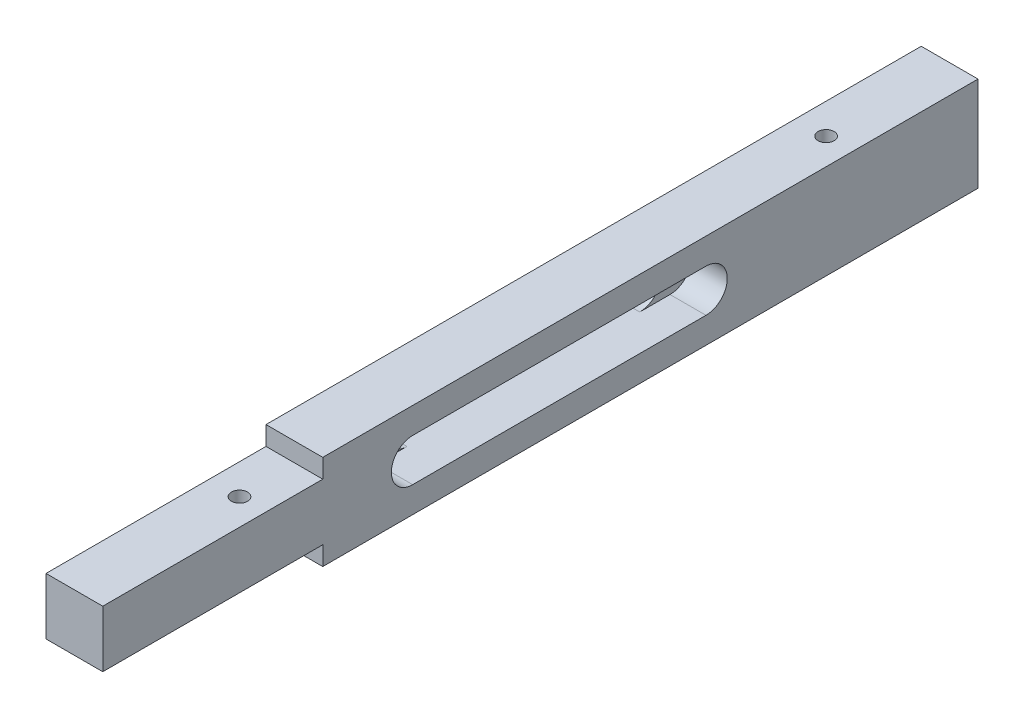
ISO-10303-21;
HEADER;
FILE_DESCRIPTION(('STEP AP214'),'2;1');
FILE_NAME('part.step','',(''),(''),'','','');
FILE_SCHEMA(('AUTOMOTIVE_DESIGN { 1 0 10303 214 1 1 1 1 }'));
ENDSEC;
DATA;
#1=APPLICATION_CONTEXT('core data for automotive mechanical design processes');
#2=APPLICATION_PROTOCOL_DEFINITION('international standard','automotive_design',2000,#1);
#3=PRODUCT_CONTEXT('',#1,'mechanical');
#4=PRODUCT('Part','Part','',(#3));
#5=PRODUCT_RELATED_PRODUCT_CATEGORY('part','',(#4));
#6=PRODUCT_DEFINITION_FORMATION('','',#4);
#7=PRODUCT_DEFINITION_CONTEXT('part definition',#1,'design');
#8=PRODUCT_DEFINITION('design','',#6,#7);
#9=PRODUCT_DEFINITION_SHAPE('','',#8);
#10=(LENGTH_UNIT() NAMED_UNIT(*) SI_UNIT(.MILLI.,.METRE.));
#11=(NAMED_UNIT(*) PLANE_ANGLE_UNIT() SI_UNIT($,.RADIAN.));
#12=(NAMED_UNIT(*) SI_UNIT($,.STERADIAN.) SOLID_ANGLE_UNIT());
#13=UNCERTAINTY_MEASURE_WITH_UNIT(LENGTH_MEASURE(1.E-05),#10,'distance_accuracy_value','');
#14=(GEOMETRIC_REPRESENTATION_CONTEXT(3) GLOBAL_UNCERTAINTY_ASSIGNED_CONTEXT((#13)) GLOBAL_UNIT_ASSIGNED_CONTEXT((#10,
#11,#12)) REPRESENTATION_CONTEXT('',''));
#15=CARTESIAN_POINT('',(0.,0.,0.));
#16=DIRECTION('',(0.,0.,1.));
#17=DIRECTION('',(1.,0.,0.));
#18=AXIS2_PLACEMENT_3D('',#15,#16,#17);
#19=CARTESIAN_POINT('',(-6.,0.,0.));
#20=DIRECTION('',(-1.,0.,0.));
#21=DIRECTION('',(0.,0.,1.));
#22=AXIS2_PLACEMENT_3D('',#19,#20,#21);
#23=PLANE('',#22);
#24=DIRECTION('',(0.,0.,-1.));
#25=VECTOR('',#24,1.);
#26=CARTESIAN_POINT('',(-6.,5.,25.));
#27=LINE('',#26,#25);
#28=CARTESIAN_POINT('',(-6.,5.,25.));
#29=VERTEX_POINT('',#28);
#30=CARTESIAN_POINT('',(-6.,5.,-44.25));
#31=VERTEX_POINT('',#30);
#32=EDGE_CURVE('E149',#29,#31,#27,.T.);
#33=ORIENTED_EDGE('',*,*,#32,.T.);
#34=DIRECTION('',(0.,-1.,0.));
#35=VECTOR('',#34,1.);
#36=CARTESIAN_POINT('',(-6.,0.,-44.25));
#37=LINE('',#36,#35);
#38=CARTESIAN_POINT('',(-6.,-5.,-44.25));
#39=VERTEX_POINT('',#38);
#40=EDGE_CURVE('E153',#31,#39,#37,.T.);
#41=ORIENTED_EDGE('',*,*,#40,.T.);
#42=DIRECTION('',(0.,0.,-1.));
#43=VECTOR('',#42,1.);
#44=CARTESIAN_POINT('',(-6.,-5.,25.));
#45=LINE('',#44,#43);
#46=CARTESIAN_POINT('',(-6.,-5.,25.));
#47=VERTEX_POINT('',#46);
#48=EDGE_CURVE('E159',#47,#39,#45,.T.);
#49=ORIENTED_EDGE('',*,*,#48,.F.);
#50=DIRECTION('',(0.,-1.,0.));
#51=VECTOR('',#50,1.);
#52=CARTESIAN_POINT('',(-6.,-3.,25.));
#53=LINE('',#52,#51);
#54=CARTESIAN_POINT('',(-6.,-3.,25.));
#55=VERTEX_POINT('',#54);
#56=EDGE_CURVE('E234',#55,#47,#53,.T.);
#57=ORIENTED_EDGE('',*,*,#56,.F.);
#58=DIRECTION('',(0.,0.,-1.));
#59=VECTOR('',#58,1.);
#60=CARTESIAN_POINT('',(-6.,-3.,48.25));
#61=LINE('',#60,#59);
#62=CARTESIAN_POINT('',(-6.,-3.,48.25));
#63=VERTEX_POINT('',#62);
#64=EDGE_CURVE('E237',#63,#55,#61,.T.);
#65=ORIENTED_EDGE('',*,*,#64,.F.);
#66=DIRECTION('',(0.,-1.,0.));
#67=VECTOR('',#66,1.);
#68=CARTESIAN_POINT('',(-6.,3.,48.25));
#69=LINE('',#68,#67);
#70=CARTESIAN_POINT('',(-6.,3.,48.25));
#71=VERTEX_POINT('',#70);
#72=EDGE_CURVE('E240',#71,#63,#69,.T.);
#73=ORIENTED_EDGE('',*,*,#72,.F.);
#74=DIRECTION('',(0.,0.,-1.));
#75=VECTOR('',#74,1.);
#76=CARTESIAN_POINT('',(-6.,3.,48.25));
#77=LINE('',#76,#75);
#78=CARTESIAN_POINT('',(-6.,3.,25.));
#79=VERTEX_POINT('',#78);
#80=EDGE_CURVE('E243',#71,#79,#77,.T.);
#81=ORIENTED_EDGE('',*,*,#80,.T.);
#82=DIRECTION('',(0.,-1.,0.));
#83=VECTOR('',#82,1.);
#84=CARTESIAN_POINT('',(-6.,5.,25.));
#85=LINE('',#84,#83);
#86=EDGE_CURVE('E156',#29,#79,#85,.T.);
#87=ORIENTED_EDGE('',*,*,#86,.F.);
#88=EDGE_LOOP('',(#33,#41,#49,#57,#65,#73,#81,#87));
#89=FACE_BOUND('',#88,.T.);
#90=CARTESIAN_POINT('',(-6.,0.,-12.3));
#91=DIRECTION('',(1.,0.,0.));
#92=DIRECTION('',(0.,0.,-1.));
#93=AXIS2_PLACEMENT_3D('',#90,#91,#92);
#94=CIRCLE('',#93,2.25);
#95=CARTESIAN_POINT('',(-6.,-2.25,-12.3));
#96=VERTEX_POINT('',#95);
#97=CARTESIAN_POINT('',(-6.,2.25,-12.3));
#98=VERTEX_POINT('',#97);
#99=EDGE_CURVE('E183',#96,#98,#94,.T.);
#100=ORIENTED_EDGE('',*,*,#99,.T.);
#101=DIRECTION('',(0.,0.,-1.));
#102=VECTOR('',#101,1.);
#103=CARTESIAN_POINT('',(-6.,2.25,12.3));
#104=LINE('',#103,#102);
#105=CARTESIAN_POINT('',(-6.,2.25,12.3));
#106=VERTEX_POINT('',#105);
#107=EDGE_CURVE('E169',#106,#98,#104,.T.);
#108=ORIENTED_EDGE('',*,*,#107,.F.);
#109=CARTESIAN_POINT('',(-6.,0.,12.3));
#110=DIRECTION('',(1.,0.,0.));
#111=DIRECTION('',(0.,0.,-1.));
#112=AXIS2_PLACEMENT_3D('',#109,#110,#111);
#113=CIRCLE('',#112,2.25);
#114=CARTESIAN_POINT('',(-6.,-2.25,12.3));
#115=VERTEX_POINT('',#114);
#116=EDGE_CURVE('E187',#106,#115,#113,.T.);
#117=ORIENTED_EDGE('',*,*,#116,.T.);
#118=DIRECTION('',(0.,0.,-1.));
#119=VECTOR('',#118,1.);
#120=CARTESIAN_POINT('',(-6.,-2.25,12.3));
#121=LINE('',#120,#119);
#122=EDGE_CURVE('E50',#115,#96,#121,.T.);
#123=ORIENTED_EDGE('',*,*,#122,.T.);
#124=EDGE_LOOP('',(#100,#108,#117,#123));
#125=FACE_BOUND('',#124,.T.);
#126=ADVANCED_FACE('F34',(#89,#125),#23,.T.);
#127=CARTESIAN_POINT('',(0.,0.,0.));
#128=DIRECTION('',(-1.,0.,0.));
#129=DIRECTION('',(0.,0.,1.));
#130=AXIS2_PLACEMENT_3D('',#127,#128,#129);
#131=PLANE('',#130);
#132=DIRECTION('',(0.,-1.,0.));
#133=VECTOR('',#132,1.);
#134=CARTESIAN_POINT('',(0.,0.,-44.25));
#135=LINE('',#134,#133);
#136=CARTESIAN_POINT('',(0.,5.,-44.25));
#137=VERTEX_POINT('',#136);
#138=CARTESIAN_POINT('',(0.,-5.,-44.25));
#139=VERTEX_POINT('',#138);
#140=EDGE_CURVE('E170',#137,#139,#135,.T.);
#141=ORIENTED_EDGE('',*,*,#140,.F.);
#142=DIRECTION('',(0.,0.,-1.));
#143=VECTOR('',#142,1.);
#144=CARTESIAN_POINT('',(0.,5.,25.));
#145=LINE('',#144,#143);
#146=CARTESIAN_POINT('',(0.,5.,25.));
#147=VERTEX_POINT('',#146);
#148=EDGE_CURVE('E173',#147,#137,#145,.T.);
#149=ORIENTED_EDGE('',*,*,#148,.F.);
#150=DIRECTION('',(0.,-1.,0.));
#151=VECTOR('',#150,1.);
#152=CARTESIAN_POINT('',(0.,5.,25.));
#153=LINE('',#152,#151);
#154=CARTESIAN_POINT('',(0.,3.,25.));
#155=VERTEX_POINT('',#154);
#156=EDGE_CURVE('E160',#147,#155,#153,.T.);
#157=ORIENTED_EDGE('',*,*,#156,.T.);
#158=DIRECTION('',(0.,0.,-1.));
#159=VECTOR('',#158,1.);
#160=CARTESIAN_POINT('',(0.,3.,48.25));
#161=LINE('',#160,#159);
#162=CARTESIAN_POINT('',(0.,3.,48.25));
#163=VERTEX_POINT('',#162);
#164=EDGE_CURVE('E259',#163,#155,#161,.T.);
#165=ORIENTED_EDGE('',*,*,#164,.F.);
#166=DIRECTION('',(0.,-1.,0.));
#167=VECTOR('',#166,1.);
#168=CARTESIAN_POINT('',(0.,3.,48.25));
#169=LINE('',#168,#167);
#170=CARTESIAN_POINT('',(0.,-3.,48.25));
#171=VERTEX_POINT('',#170);
#172=EDGE_CURVE('E256',#163,#171,#169,.T.);
#173=ORIENTED_EDGE('',*,*,#172,.T.);
#174=DIRECTION('',(0.,0.,-1.));
#175=VECTOR('',#174,1.);
#176=CARTESIAN_POINT('',(0.,-3.,48.25));
#177=LINE('',#176,#175);
#178=CARTESIAN_POINT('',(0.,-3.,25.));
#179=VERTEX_POINT('',#178);
#180=EDGE_CURVE('E253',#171,#179,#177,.T.);
#181=ORIENTED_EDGE('',*,*,#180,.T.);
#182=DIRECTION('',(0.,-1.,0.));
#183=VECTOR('',#182,1.);
#184=CARTESIAN_POINT('',(0.,-3.,25.));
#185=LINE('',#184,#183);
#186=CARTESIAN_POINT('',(0.,-5.,25.));
#187=VERTEX_POINT('',#186);
#188=EDGE_CURVE('E250',#179,#187,#185,.T.);
#189=ORIENTED_EDGE('',*,*,#188,.T.);
#190=DIRECTION('',(0.,0.,-1.));
#191=VECTOR('',#190,1.);
#192=CARTESIAN_POINT('',(0.,-5.,25.));
#193=LINE('',#192,#191);
#194=EDGE_CURVE('E248',#187,#139,#193,.T.);
#195=ORIENTED_EDGE('',*,*,#194,.T.);
#196=EDGE_LOOP('',(#141,#149,#157,#165,#173,#181,#189,#195));
#197=FACE_BOUND('',#196,.T.);
#198=DIRECTION('',(0.,0.,-1.));
#199=VECTOR('',#198,1.);
#200=CARTESIAN_POINT('',(0.,2.25,15.5));
#201=LINE('',#200,#199);
#202=CARTESIAN_POINT('',(0.,2.25,15.5));
#203=VERTEX_POINT('',#202);
#204=CARTESIAN_POINT('',(0.,2.25,-15.5));
#205=VERTEX_POINT('',#204);
#206=EDGE_CURVE('E198',#203,#205,#201,.T.);
#207=ORIENTED_EDGE('',*,*,#206,.T.);
#208=CARTESIAN_POINT('',(0.,0.,-15.5));
#209=DIRECTION('',(1.,0.,0.));
#210=DIRECTION('',(0.,0.,-1.));
#211=AXIS2_PLACEMENT_3D('',#208,#209,#210);
#212=CIRCLE('',#211,2.25);
#213=CARTESIAN_POINT('',(0.,-2.24999999999999,-15.5));
#214=VERTEX_POINT('',#213);
#215=EDGE_CURVE('E215',#214,#205,#212,.T.);
#216=ORIENTED_EDGE('',*,*,#215,.F.);
#217=DIRECTION('',(0.,0.,-1.));
#218=VECTOR('',#217,1.);
#219=CARTESIAN_POINT('',(0.,-2.25,15.5));
#220=LINE('',#219,#218);
#221=CARTESIAN_POINT('',(0.,-2.25,15.5));
#222=VERTEX_POINT('',#221);
#223=EDGE_CURVE('E218',#222,#214,#220,.T.);
#224=ORIENTED_EDGE('',*,*,#223,.F.);
#225=CARTESIAN_POINT('',(0.,0.,15.5));
#226=DIRECTION('',(1.,0.,0.));
#227=DIRECTION('',(0.,0.,-1.));
#228=AXIS2_PLACEMENT_3D('',#225,#226,#227);
#229=CIRCLE('',#228,2.25);
#230=EDGE_CURVE('E220',#203,#222,#229,.T.);
#231=ORIENTED_EDGE('',*,*,#230,.F.);
#232=EDGE_LOOP('',(#207,#216,#224,#231));
#233=FACE_BOUND('',#232,.T.);
#234=ADVANCED_FACE('F294',(#197,#233),#131,.F.);
#235=CARTESIAN_POINT('',(-3.8,0.,-15.5));
#236=DIRECTION('',(1.,0.,0.));
#237=DIRECTION('',(0.,0.,-1.));
#238=AXIS2_PLACEMENT_3D('',#235,#236,#237);
#239=PLANE('',#238);
#240=CARTESIAN_POINT('',(-3.8,0.,-12.3));
#241=DIRECTION('',(1.,0.,0.));
#242=DIRECTION('',(0.,0.,-1.));
#243=AXIS2_PLACEMENT_3D('',#240,#241,#242);
#244=CIRCLE('',#243,2.25);
#245=CARTESIAN_POINT('',(-3.8,-2.25,-12.3));
#246=VERTEX_POINT('',#245);
#247=CARTESIAN_POINT('',(-3.8,2.25,-12.3));
#248=VERTEX_POINT('',#247);
#249=EDGE_CURVE('E11',#246,#248,#244,.T.);
#250=ORIENTED_EDGE('',*,*,#249,.F.);
#251=DIRECTION('',(0.,0.,-1.));
#252=VECTOR('',#251,1.);
#253=CARTESIAN_POINT('',(-3.8,-2.25,15.5));
#254=LINE('',#253,#252);
#255=CARTESIAN_POINT('',(-3.8,-2.24999999999999,-15.5));
#256=VERTEX_POINT('',#255);
#257=EDGE_CURVE('E206',#246,#256,#254,.T.);
#258=ORIENTED_EDGE('',*,*,#257,.T.);
#259=CARTESIAN_POINT('',(-3.8,0.,-15.5));
#260=DIRECTION('',(1.,0.,0.));
#261=DIRECTION('',(0.,0.,-1.));
#262=AXIS2_PLACEMENT_3D('',#259,#260,#261);
#263=CIRCLE('',#262,2.25);
#264=CARTESIAN_POINT('',(-3.8,2.25,-15.5));
#265=VERTEX_POINT('',#264);
#266=EDGE_CURVE('E202',#256,#265,#263,.T.);
#267=ORIENTED_EDGE('',*,*,#266,.T.);
#268=DIRECTION('',(0.,0.,-1.));
#269=VECTOR('',#268,1.);
#270=CARTESIAN_POINT('',(-3.8,2.25,15.5));
#271=LINE('',#270,#269);
#272=EDGE_CURVE('E203',#248,#265,#271,.T.);
#273=ORIENTED_EDGE('',*,*,#272,.F.);
#274=EDGE_LOOP('',(#250,#258,#267,#273));
#275=FACE_BOUND('',#274,.T.);
#276=ADVANCED_FACE('F300',(#275),#239,.T.);
#277=CARTESIAN_POINT('',(-6.,5.,25.));
#278=DIRECTION('',(0.,-1.,0.));
#279=DIRECTION('',(0.,0.,-1.));
#280=AXIS2_PLACEMENT_3D('',#277,#278,#279);
#281=PLANE('',#280);
#282=CARTESIAN_POINT('',(-2.79999999999999,5.,-31.0000000000001));
#283=DIRECTION('',(0.,-1.,0.));
#284=DIRECTION('',(0.,0.,-1.));
#285=AXIS2_PLACEMENT_3D('',#282,#283,#284);
#286=CIRCLE('',#285,0.850000000000017);
#287=CARTESIAN_POINT('',(-2.79999999999999,5.,-31.8500000000001));
#288=VERTEX_POINT('',#287);
#289=EDGE_CURVE('E360',#288,#288,#286,.T.);
#290=ORIENTED_EDGE('',*,*,#289,.T.);
#291=EDGE_LOOP('',(#290));
#292=FACE_BOUND('',#291,.T.);
#293=ORIENTED_EDGE('',*,*,#148,.T.);
#294=DIRECTION('',(1.,0.,0.));
#295=VECTOR('',#294,1.);
#296=CARTESIAN_POINT('',(0.,5.,-44.25));
#297=LINE('',#296,#295);
#298=EDGE_CURVE('E166',#31,#137,#297,.T.);
#299=ORIENTED_EDGE('',*,*,#298,.F.);
#300=ORIENTED_EDGE('',*,*,#32,.F.);
#301=DIRECTION('',(1.,0.,0.));
#302=VECTOR('',#301,1.);
#303=CARTESIAN_POINT('',(-6.,5.,25.));
#304=LINE('',#303,#302);
#305=EDGE_CURVE('E246',#29,#147,#304,.T.);
#306=ORIENTED_EDGE('',*,*,#305,.T.);
#307=EDGE_LOOP('',(#293,#299,#300,#306));
#308=FACE_BOUND('',#307,.T.);
#309=ADVANCED_FACE('F36',(#292,#308),#281,.F.);
#310=CARTESIAN_POINT('',(-6.,-5.,25.));
#311=DIRECTION('',(0.,-1.,0.));
#312=DIRECTION('',(0.,0.,-1.));
#313=AXIS2_PLACEMENT_3D('',#310,#311,#312);
#314=PLANE('',#313);
#315=CARTESIAN_POINT('',(-2.79999999999999,-5.,-31.0000000000001));
#316=DIRECTION('',(0.,-1.,0.));
#317=DIRECTION('',(0.,0.,-1.));
#318=AXIS2_PLACEMENT_3D('',#315,#316,#317);
#319=CIRCLE('',#318,0.850000000000017);
#320=CARTESIAN_POINT('',(-2.79999999999999,-5.,-31.8500000000001));
#321=VERTEX_POINT('',#320);
#322=EDGE_CURVE('E345',#321,#321,#319,.T.);
#323=ORIENTED_EDGE('',*,*,#322,.F.);
#324=EDGE_LOOP('',(#323));
#325=FACE_BOUND('',#324,.T.);
#326=ORIENTED_EDGE('',*,*,#194,.F.);
#327=DIRECTION('',(1.,0.,0.));
#328=VECTOR('',#327,1.);
#329=CARTESIAN_POINT('',(-6.,-5.,25.));
#330=LINE('',#329,#328);
#331=EDGE_CURVE('E273',#47,#187,#330,.T.);
#332=ORIENTED_EDGE('',*,*,#331,.F.);
#333=ORIENTED_EDGE('',*,*,#48,.T.);
#334=DIRECTION('',(-1.,0.,0.));
#335=VECTOR('',#334,1.);
#336=CARTESIAN_POINT('',(0.,-5.,-44.25));
#337=LINE('',#336,#335);
#338=EDGE_CURVE('E168',#139,#39,#337,.T.);
#339=ORIENTED_EDGE('',*,*,#338,.F.);
#340=EDGE_LOOP('',(#326,#332,#333,#339));
#341=FACE_BOUND('',#340,.T.);
#342=ADVANCED_FACE('F334',(#325,#341),#314,.T.);
#343=CARTESIAN_POINT('',(-6.,-3.,25.));
#344=DIRECTION('',(0.,0.,1.));
#345=DIRECTION('',(1.,0.,0.));
#346=AXIS2_PLACEMENT_3D('',#343,#344,#345);
#347=PLANE('',#346);
#348=ORIENTED_EDGE('',*,*,#188,.F.);
#349=DIRECTION('',(1.,0.,0.));
#350=VECTOR('',#349,1.);
#351=CARTESIAN_POINT('',(-6.,-3.,25.));
#352=LINE('',#351,#350);
#353=EDGE_CURVE('E271',#55,#179,#352,.T.);
#354=ORIENTED_EDGE('',*,*,#353,.F.);
#355=ORIENTED_EDGE('',*,*,#56,.T.);
#356=ORIENTED_EDGE('',*,*,#331,.T.);
#357=EDGE_LOOP('',(#348,#354,#355,#356));
#358=FACE_BOUND('',#357,.T.);
#359=ADVANCED_FACE('F331',(#358),#347,.T.);
#360=CARTESIAN_POINT('',(-6.,-3.,48.25));
#361=DIRECTION('',(0.,-1.,0.));
#362=DIRECTION('',(0.,0.,-1.));
#363=AXIS2_PLACEMENT_3D('',#360,#361,#362);
#364=PLANE('',#363);
#365=CARTESIAN_POINT('',(-2.79999999999999,-3.,31.));
#366=DIRECTION('',(0.,-1.,0.));
#367=DIRECTION('',(0.,0.,-1.));
#368=AXIS2_PLACEMENT_3D('',#365,#366,#367);
#369=CIRCLE('',#368,0.850000000000017);
#370=CARTESIAN_POINT('',(-2.79999999999999,-3.,30.1499999999999));
#371=VERTEX_POINT('',#370);
#372=EDGE_CURVE('E175',#371,#371,#369,.T.);
#373=ORIENTED_EDGE('',*,*,#372,.F.);
#374=EDGE_LOOP('',(#373));
#375=FACE_BOUND('',#374,.T.);
#376=ORIENTED_EDGE('',*,*,#180,.F.);
#377=DIRECTION('',(1.,0.,0.));
#378=VECTOR('',#377,1.);
#379=CARTESIAN_POINT('',(-6.,-3.,48.25));
#380=LINE('',#379,#378);
#381=EDGE_CURVE('E269',#63,#171,#380,.T.);
#382=ORIENTED_EDGE('',*,*,#381,.F.);
#383=ORIENTED_EDGE('',*,*,#64,.T.);
#384=ORIENTED_EDGE('',*,*,#353,.T.);
#385=EDGE_LOOP('',(#376,#382,#383,#384));
#386=FACE_BOUND('',#385,.T.);
#387=ADVANCED_FACE('F327',(#375,#386),#364,.T.);
#388=CARTESIAN_POINT('',(-6.,3.,48.25));
#389=DIRECTION('',(0.,0.,1.));
#390=DIRECTION('',(0.,-1.,0.));
#391=AXIS2_PLACEMENT_3D('',#388,#389,#390);
#392=PLANE('',#391);
#393=ORIENTED_EDGE('',*,*,#172,.F.);
#394=DIRECTION('',(1.,0.,0.));
#395=VECTOR('',#394,1.);
#396=CARTESIAN_POINT('',(-6.,3.,48.25));
#397=LINE('',#396,#395);
#398=EDGE_CURVE('E267',#71,#163,#397,.T.);
#399=ORIENTED_EDGE('',*,*,#398,.F.);
#400=ORIENTED_EDGE('',*,*,#72,.T.);
#401=ORIENTED_EDGE('',*,*,#381,.T.);
#402=EDGE_LOOP('',(#393,#399,#400,#401));
#403=FACE_BOUND('',#402,.T.);
#404=ADVANCED_FACE('F323',(#403),#392,.T.);
#405=CARTESIAN_POINT('',(-6.,3.,48.25));
#406=DIRECTION('',(0.,-1.,0.));
#407=DIRECTION('',(0.,0.,-1.));
#408=AXIS2_PLACEMENT_3D('',#405,#406,#407);
#409=PLANE('',#408);
#410=CARTESIAN_POINT('',(-2.79999999999999,3.,31.));
#411=DIRECTION('',(0.,-1.,0.));
#412=DIRECTION('',(0.,0.,-1.));
#413=AXIS2_PLACEMENT_3D('',#410,#411,#412);
#414=CIRCLE('',#413,0.850000000000017);
#415=CARTESIAN_POINT('',(-2.79999999999999,3.,30.1499999999999));
#416=VERTEX_POINT('',#415);
#417=EDGE_CURVE('E38',#416,#416,#414,.T.);
#418=ORIENTED_EDGE('',*,*,#417,.T.);
#419=EDGE_LOOP('',(#418));
#420=FACE_BOUND('',#419,.T.);
#421=ORIENTED_EDGE('',*,*,#164,.T.);
#422=DIRECTION('',(1.,0.,0.));
#423=VECTOR('',#422,1.);
#424=CARTESIAN_POINT('',(-6.,3.,25.));
#425=LINE('',#424,#423);
#426=EDGE_CURVE('E265',#79,#155,#425,.T.);
#427=ORIENTED_EDGE('',*,*,#426,.F.);
#428=ORIENTED_EDGE('',*,*,#80,.F.);
#429=ORIENTED_EDGE('',*,*,#398,.T.);
#430=EDGE_LOOP('',(#421,#427,#428,#429));
#431=FACE_BOUND('',#430,.T.);
#432=ADVANCED_FACE('F319',(#420,#431),#409,.F.);
#433=CARTESIAN_POINT('',(-6.,5.,25.));
#434=DIRECTION('',(0.,0.,1.));
#435=DIRECTION('',(1.,0.,0.));
#436=AXIS2_PLACEMENT_3D('',#433,#434,#435);
#437=PLANE('',#436);
#438=ORIENTED_EDGE('',*,*,#156,.F.);
#439=ORIENTED_EDGE('',*,*,#305,.F.);
#440=ORIENTED_EDGE('',*,*,#86,.T.);
#441=ORIENTED_EDGE('',*,*,#426,.T.);
#442=EDGE_LOOP('',(#438,#439,#440,#441));
#443=FACE_BOUND('',#442,.T.);
#444=ADVANCED_FACE('F316',(#443),#437,.T.);
#445=CARTESIAN_POINT('',(-3.8,2.25,15.5));
#446=DIRECTION('',(0.,-1.,0.));
#447=DIRECTION('',(0.,0.,-1.));
#448=AXIS2_PLACEMENT_3D('',#445,#446,#447);
#449=PLANE('',#448);
#450=DIRECTION('',(1.,0.,0.));
#451=VECTOR('',#450,1.);
#452=CARTESIAN_POINT('',(-3.8,2.25,-15.5));
#453=LINE('',#452,#451);
#454=EDGE_CURVE('E230',#265,#205,#453,.T.);
#455=ORIENTED_EDGE('',*,*,#454,.T.);
#456=ORIENTED_EDGE('',*,*,#206,.F.);
#457=DIRECTION('',(1.,0.,0.));
#458=VECTOR('',#457,1.);
#459=CARTESIAN_POINT('',(-3.8,2.25,15.5));
#460=LINE('',#459,#458);
#461=CARTESIAN_POINT('',(-3.8,2.25,15.5));
#462=VERTEX_POINT('',#461);
#463=EDGE_CURVE('E213',#462,#203,#460,.T.);
#464=ORIENTED_EDGE('',*,*,#463,.F.);
#465=CARTESIAN_POINT('',(-3.8,2.25,12.3));
#466=VERTEX_POINT('',#465);
#467=EDGE_CURVE('E199',#462,#466,#271,.T.);
#468=ORIENTED_EDGE('',*,*,#467,.T.);
#469=DIRECTION('',(1.,0.,0.));
#470=VECTOR('',#469,1.);
#471=CARTESIAN_POINT('',(-6.,2.25,12.3));
#472=LINE('',#471,#470);
#473=EDGE_CURVE('E58',#106,#466,#472,.T.);
#474=ORIENTED_EDGE('',*,*,#473,.F.);
#475=ORIENTED_EDGE('',*,*,#107,.T.);
#476=DIRECTION('',(1.,0.,0.));
#477=VECTOR('',#476,1.);
#478=CARTESIAN_POINT('',(-6.,2.25,-12.3));
#479=LINE('',#478,#477);
#480=EDGE_CURVE('E195',#98,#248,#479,.T.);
#481=ORIENTED_EDGE('',*,*,#480,.T.);
#482=ORIENTED_EDGE('',*,*,#272,.T.);
#483=EDGE_LOOP('',(#455,#456,#464,#468,#474,#475,#481,#482));
#484=FACE_BOUND('',#483,.T.);
#485=ADVANCED_FACE('F296',(#484),#449,.T.);
#486=CARTESIAN_POINT('',(-3.8,0.,-15.5));
#487=DIRECTION('',(1.,0.,0.));
#488=DIRECTION('',(0.,0.,-1.));
#489=AXIS2_PLACEMENT_3D('',#486,#487,#488);
#490=CYLINDRICAL_SURFACE('',#489,2.25);
#491=ORIENTED_EDGE('',*,*,#215,.T.);
#492=ORIENTED_EDGE('',*,*,#454,.F.);
#493=ORIENTED_EDGE('',*,*,#266,.F.);
#494=DIRECTION('',(1.,0.,0.));
#495=VECTOR('',#494,1.);
#496=CARTESIAN_POINT('',(-3.8,-2.24999999999999,-15.5));
#497=LINE('',#496,#495);
#498=EDGE_CURVE('E227',#256,#214,#497,.T.);
#499=ORIENTED_EDGE('',*,*,#498,.T.);
#500=EDGE_LOOP('',(#491,#492,#493,#499));
#501=FACE_BOUND('',#500,.T.);
#502=ADVANCED_FACE('F292',(#501),#490,.F.);
#503=CARTESIAN_POINT('',(-3.8,-2.25,15.5));
#504=DIRECTION('',(0.,-1.,0.));
#505=DIRECTION('',(0.,0.,-1.));
#506=AXIS2_PLACEMENT_3D('',#503,#504,#505);
#507=PLANE('',#506);
#508=ORIENTED_EDGE('',*,*,#257,.F.);
#509=DIRECTION('',(1.,0.,0.));
#510=VECTOR('',#509,1.);
#511=CARTESIAN_POINT('',(-6.,-2.25,-12.3));
#512=LINE('',#511,#510);
#513=EDGE_CURVE('E193',#96,#246,#512,.T.);
#514=ORIENTED_EDGE('',*,*,#513,.F.);
#515=ORIENTED_EDGE('',*,*,#122,.F.);
#516=DIRECTION('',(1.,0.,0.));
#517=VECTOR('',#516,1.);
#518=CARTESIAN_POINT('',(-6.,-2.25,12.3));
#519=LINE('',#518,#517);
#520=CARTESIAN_POINT('',(-3.8,-2.25,12.3));
#521=VERTEX_POINT('',#520);
#522=EDGE_CURVE('E191',#115,#521,#519,.T.);
#523=ORIENTED_EDGE('',*,*,#522,.T.);
#524=CARTESIAN_POINT('',(-3.8,-2.25,15.5));
#525=VERTEX_POINT('',#524);
#526=EDGE_CURVE('E207',#525,#521,#254,.T.);
#527=ORIENTED_EDGE('',*,*,#526,.F.);
#528=DIRECTION('',(1.,0.,0.));
#529=VECTOR('',#528,1.);
#530=CARTESIAN_POINT('',(-3.8,-2.25,15.5));
#531=LINE('',#530,#529);
#532=EDGE_CURVE('E225',#525,#222,#531,.T.);
#533=ORIENTED_EDGE('',*,*,#532,.T.);
#534=ORIENTED_EDGE('',*,*,#223,.T.);
#535=ORIENTED_EDGE('',*,*,#498,.F.);
#536=EDGE_LOOP('',(#508,#514,#515,#523,#527,#533,#534,#535));
#537=FACE_BOUND('',#536,.T.);
#538=ADVANCED_FACE('F280',(#537),#507,.F.);
#539=CARTESIAN_POINT('',(-3.8,0.,15.5));
#540=DIRECTION('',(1.,0.,0.));
#541=DIRECTION('',(0.,0.,-1.));
#542=AXIS2_PLACEMENT_3D('',#539,#540,#541);
#543=CYLINDRICAL_SURFACE('',#542,2.25);
#544=ORIENTED_EDGE('',*,*,#230,.T.);
#545=ORIENTED_EDGE('',*,*,#532,.F.);
#546=CARTESIAN_POINT('',(-3.8,0.,15.5));
#547=DIRECTION('',(1.,0.,0.));
#548=DIRECTION('',(0.,0.,-1.));
#549=AXIS2_PLACEMENT_3D('',#546,#547,#548);
#550=CIRCLE('',#549,2.25);
#551=EDGE_CURVE('E210',#462,#525,#550,.T.);
#552=ORIENTED_EDGE('',*,*,#551,.F.);
#553=ORIENTED_EDGE('',*,*,#463,.T.);
#554=EDGE_LOOP('',(#544,#545,#552,#553));
#555=FACE_BOUND('',#554,.T.);
#556=ADVANCED_FACE('F284',(#555),#543,.F.);
#557=CARTESIAN_POINT('',(-3.8,0.,12.3));
#558=DIRECTION('',(1.,0.,0.));
#559=DIRECTION('',(0.,0.,-1.));
#560=AXIS2_PLACEMENT_3D('',#557,#558,#559);
#561=CIRCLE('',#560,2.25);
#562=EDGE_CURVE('E43',#466,#521,#561,.T.);
#563=ORIENTED_EDGE('',*,*,#562,.F.);
#564=ORIENTED_EDGE('',*,*,#467,.F.);
#565=ORIENTED_EDGE('',*,*,#551,.T.);
#566=ORIENTED_EDGE('',*,*,#526,.T.);
#567=EDGE_LOOP('',(#563,#564,#565,#566));
#568=FACE_BOUND('',#567,.T.);
#569=ADVANCED_FACE('F281',(#568),#239,.T.);
#570=CARTESIAN_POINT('',(-6.,0.,-12.3));
#571=DIRECTION('',(1.,0.,0.));
#572=DIRECTION('',(0.,0.,-1.));
#573=AXIS2_PLACEMENT_3D('',#570,#571,#572);
#574=CYLINDRICAL_SURFACE('',#573,2.25);
#575=ORIENTED_EDGE('',*,*,#249,.T.);
#576=ORIENTED_EDGE('',*,*,#480,.F.);
#577=ORIENTED_EDGE('',*,*,#99,.F.);
#578=ORIENTED_EDGE('',*,*,#513,.T.);
#579=EDGE_LOOP('',(#575,#576,#577,#578));
#580=FACE_BOUND('',#579,.T.);
#581=ADVANCED_FACE('F304',(#580),#574,.F.);
#582=CARTESIAN_POINT('',(-6.,0.,12.3));
#583=DIRECTION('',(1.,0.,0.));
#584=DIRECTION('',(0.,0.,-1.));
#585=AXIS2_PLACEMENT_3D('',#582,#583,#584);
#586=CYLINDRICAL_SURFACE('',#585,2.25);
#587=ORIENTED_EDGE('',*,*,#562,.T.);
#588=ORIENTED_EDGE('',*,*,#522,.F.);
#589=ORIENTED_EDGE('',*,*,#116,.F.);
#590=ORIENTED_EDGE('',*,*,#473,.T.);
#591=EDGE_LOOP('',(#587,#588,#589,#590));
#592=FACE_BOUND('',#591,.T.);
#593=ADVANCED_FACE('F275',(#592),#586,.F.);
#594=CARTESIAN_POINT('',(0.,0.,-44.25));
#595=DIRECTION('',(0.,0.,-1.));
#596=DIRECTION('',(-1.,0.,0.));
#597=AXIS2_PLACEMENT_3D('',#594,#595,#596);
#598=PLANE('',#597);
#599=CARTESIAN_POINT('',(-3.,0.,-44.25));
#600=DIRECTION('',(0.,0.,-1.));
#601=DIRECTION('',(-1.,0.,0.));
#602=AXIS2_PLACEMENT_3D('',#599,#600,#601);
#603=CIRCLE('',#602,0.85);
#604=CARTESIAN_POINT('',(-3.85,0.,-44.25));
#605=VERTEX_POINT('',#604);
#606=EDGE_CURVE('E366',#605,#605,#603,.T.);
#607=ORIENTED_EDGE('',*,*,#606,.F.);
#608=EDGE_LOOP('',(#607));
#609=FACE_BOUND('',#608,.T.);
#610=ORIENTED_EDGE('',*,*,#40,.F.);
#611=ORIENTED_EDGE('',*,*,#298,.T.);
#612=ORIENTED_EDGE('',*,*,#140,.T.);
#613=ORIENTED_EDGE('',*,*,#338,.T.);
#614=EDGE_LOOP('',(#610,#611,#612,#613));
#615=FACE_BOUND('',#614,.T.);
#616=ADVANCED_FACE('F164',(#609,#615),#598,.T.);
#617=CARTESIAN_POINT('',(-2.79999999999999,5.,31.));
#618=DIRECTION('',(0.,-1.,0.));
#619=DIRECTION('',(0.,0.,-1.));
#620=AXIS2_PLACEMENT_3D('',#617,#618,#619);
#621=CYLINDRICAL_SURFACE('',#620,0.850000000000017);
#622=ORIENTED_EDGE('',*,*,#372,.T.);
#623=EDGE_LOOP('',(#622));
#624=FACE_BOUND('',#623,.T.);
#625=ORIENTED_EDGE('',*,*,#417,.F.);
#626=EDGE_LOOP('',(#625));
#627=FACE_BOUND('',#626,.T.);
#628=ADVANCED_FACE('F375',(#624,#627),#621,.F.);
#629=CARTESIAN_POINT('',(-2.79999999999999,5.,-31.0000000000001));
#630=DIRECTION('',(0.,-1.,0.));
#631=DIRECTION('',(0.,0.,-1.));
#632=AXIS2_PLACEMENT_3D('',#629,#630,#631);
#633=CYLINDRICAL_SURFACE('',#632,0.850000000000017);
#634=ORIENTED_EDGE('',*,*,#289,.F.);
#635=EDGE_LOOP('',(#634));
#636=FACE_BOUND('',#635,.T.);
#637=ORIENTED_EDGE('',*,*,#322,.T.);
#638=EDGE_LOOP('',(#637));
#639=FACE_BOUND('',#638,.T.);
#640=ADVANCED_FACE('F382',(#636,#639),#633,.F.);
#641=CARTESIAN_POINT('',(-3.,0.,-38.25));
#642=DIRECTION('',(0.,0.,-1.));
#643=DIRECTION('',(-1.,0.,0.));
#644=AXIS2_PLACEMENT_3D('',#641,#642,#643);
#645=CYLINDRICAL_SURFACE('',#644,0.85);
#646=CARTESIAN_POINT('',(-3.,0.,-38.25));
#647=DIRECTION('',(0.,0.,-1.));
#648=DIRECTION('',(-1.,0.,0.));
#649=AXIS2_PLACEMENT_3D('',#646,#647,#648);
#650=CIRCLE('',#649,0.85);
#651=CARTESIAN_POINT('',(-3.85,0.,-38.25));
#652=VERTEX_POINT('',#651);
#653=EDGE_CURVE('E361',#652,#652,#650,.T.);
#654=ORIENTED_EDGE('',*,*,#653,.F.);
#655=EDGE_LOOP('',(#654));
#656=FACE_BOUND('',#655,.T.);
#657=ORIENTED_EDGE('',*,*,#606,.T.);
#658=EDGE_LOOP('',(#657));
#659=FACE_BOUND('',#658,.T.);
#660=ADVANCED_FACE('F372',(#656,#659),#645,.F.);
#661=CARTESIAN_POINT('',(-3.,0.,-38.25));
#662=DIRECTION('',(0.,0.,-1.));
#663=DIRECTION('',(-1.,0.,0.));
#664=AXIS2_PLACEMENT_3D('',#661,#662,#663);
#665=PLANE('',#664);
#666=ORIENTED_EDGE('',*,*,#653,.T.);
#667=EDGE_LOOP('',(#666));
#668=FACE_BOUND('',#667,.T.);
#669=ADVANCED_FACE('F520',(#668),#665,.T.);
#670=CLOSED_SHELL('',(#126,#234,#276,#309,#342,#359,#387,#404,#432,#444,#485,#502,#538,#556,
#569,#581,#593,#616,#628,#640,#660,#669));
#671=MANIFOLD_SOLID_BREP('B2',#670);
#672=ADVANCED_BREP_SHAPE_REPRESENTATION('',(#18,#671),#14);
#673=SHAPE_DEFINITION_REPRESENTATION(#9,#672);
ENDSEC;
END-ISO-10303-21;
